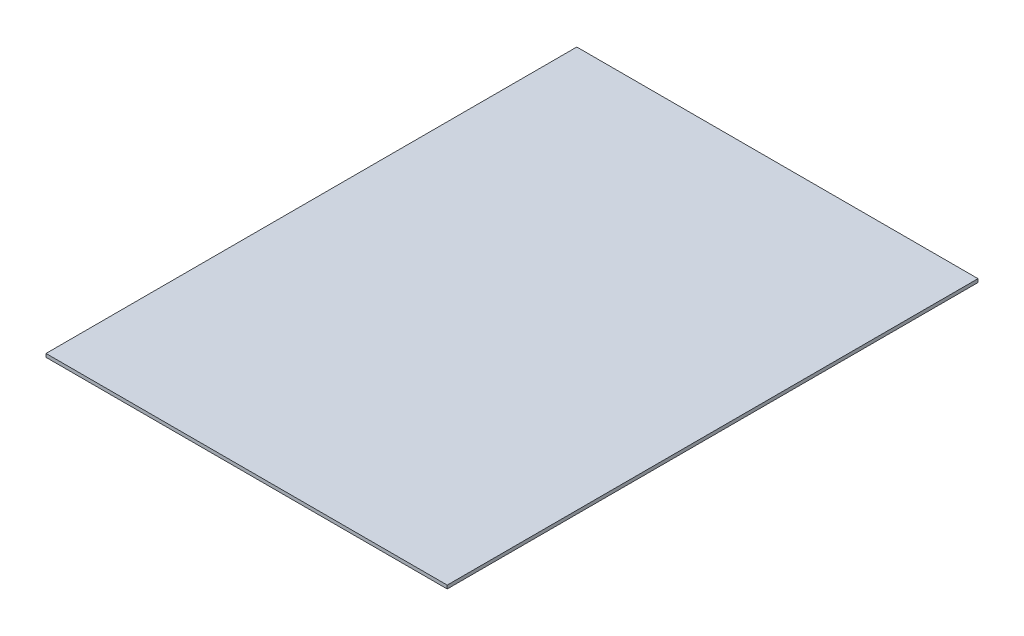
ISO-10303-21;
HEADER;
FILE_DESCRIPTION(('STEP AP214'),'2;1');
FILE_NAME('part.step','',(''),(''),'','','');
FILE_SCHEMA(('AUTOMOTIVE_DESIGN { 1 0 10303 214 1 1 1 1 }'));
ENDSEC;
DATA;
#1=APPLICATION_CONTEXT('core data for automotive mechanical design processes');
#2=APPLICATION_PROTOCOL_DEFINITION('international standard','automotive_design',2000,#1);
#3=PRODUCT_CONTEXT('',#1,'mechanical');
#4=PRODUCT('Part','Part','',(#3));
#5=PRODUCT_RELATED_PRODUCT_CATEGORY('part','',(#4));
#6=PRODUCT_DEFINITION_FORMATION('','',#4);
#7=PRODUCT_DEFINITION_CONTEXT('part definition',#1,'design');
#8=PRODUCT_DEFINITION('design','',#6,#7);
#9=PRODUCT_DEFINITION_SHAPE('','',#8);
#10=(LENGTH_UNIT() NAMED_UNIT(*) SI_UNIT(.MILLI.,.METRE.));
#11=(NAMED_UNIT(*) PLANE_ANGLE_UNIT() SI_UNIT($,.RADIAN.));
#12=(NAMED_UNIT(*) SI_UNIT($,.STERADIAN.) SOLID_ANGLE_UNIT());
#13=UNCERTAINTY_MEASURE_WITH_UNIT(LENGTH_MEASURE(1.E-05),#10,'distance_accuracy_value','');
#14=(GEOMETRIC_REPRESENTATION_CONTEXT(3) GLOBAL_UNCERTAINTY_ASSIGNED_CONTEXT((#13)) GLOBAL_UNIT_ASSIGNED_CONTEXT((#10,
#11,#12)) REPRESENTATION_CONTEXT('',''));
#15=CARTESIAN_POINT('',(0.,0.,0.));
#16=DIRECTION('',(0.,0.,1.));
#17=DIRECTION('',(1.,0.,0.));
#18=AXIS2_PLACEMENT_3D('',#15,#16,#17);
#19=CARTESIAN_POINT('',(187.198,1.5875,247.65));
#20=DIRECTION('',(-1.,0.,0.));
#21=DIRECTION('',(0.,0.,1.));
#22=AXIS2_PLACEMENT_3D('',#19,#20,#21);
#23=PLANE('',#22);
#24=DIRECTION('',(0.,0.,-1.));
#25=VECTOR('',#24,1.);
#26=CARTESIAN_POINT('',(187.198,-1.5875,247.65));
#27=LINE('',#26,#25);
#28=CARTESIAN_POINT('',(187.198,-1.5875,247.65));
#29=VERTEX_POINT('',#28);
#30=CARTESIAN_POINT('',(187.198,-1.5875,-247.65));
#31=VERTEX_POINT('',#30);
#32=EDGE_CURVE('E107',#29,#31,#27,.T.);
#33=ORIENTED_EDGE('',*,*,#32,.T.);
#34=DIRECTION('',(0.,-1.,0.));
#35=VECTOR('',#34,1.);
#36=CARTESIAN_POINT('',(187.198,1.5875,-247.65));
#37=LINE('',#36,#35);
#38=CARTESIAN_POINT('',(187.198,1.5875,-247.65));
#39=VERTEX_POINT('',#38);
#40=EDGE_CURVE('E11',#39,#31,#37,.T.);
#41=ORIENTED_EDGE('',*,*,#40,.F.);
#42=DIRECTION('',(0.,0.,-1.));
#43=VECTOR('',#42,1.);
#44=CARTESIAN_POINT('',(187.198,1.5875,247.65));
#45=LINE('',#44,#43);
#46=CARTESIAN_POINT('',(187.198,1.5875,247.65));
#47=VERTEX_POINT('',#46);
#48=EDGE_CURVE('E91',#47,#39,#45,.T.);
#49=ORIENTED_EDGE('',*,*,#48,.F.);
#50=DIRECTION('',(0.,-1.,0.));
#51=VECTOR('',#50,1.);
#52=CARTESIAN_POINT('',(187.198,1.5875,247.65));
#53=LINE('',#52,#51);
#54=EDGE_CURVE('E103',#47,#29,#53,.T.);
#55=ORIENTED_EDGE('',*,*,#54,.T.);
#56=EDGE_LOOP('',(#33,#41,#49,#55));
#57=FACE_BOUND('',#56,.T.);
#58=ADVANCED_FACE('F39',(#57),#23,.F.);
#59=CARTESIAN_POINT('',(-187.198,1.5875,-247.65));
#60=DIRECTION('',(0.,0.,1.));
#61=DIRECTION('',(1.,0.,0.));
#62=AXIS2_PLACEMENT_3D('',#59,#60,#61);
#63=PLANE('',#62);
#64=DIRECTION('',(-1.,0.,0.));
#65=VECTOR('',#64,1.);
#66=CARTESIAN_POINT('',(-187.198,-1.5875,-247.65));
#67=LINE('',#66,#65);
#68=CARTESIAN_POINT('',(-187.198,-1.5875,-247.65));
#69=VERTEX_POINT('',#68);
#70=EDGE_CURVE('E96',#31,#69,#67,.T.);
#71=ORIENTED_EDGE('',*,*,#70,.T.);
#72=DIRECTION('',(0.,-1.,0.));
#73=VECTOR('',#72,1.);
#74=CARTESIAN_POINT('',(-187.198,1.5875,-247.65));
#75=LINE('',#74,#73);
#76=CARTESIAN_POINT('',(-187.198,1.5875,-247.65));
#77=VERTEX_POINT('',#76);
#78=EDGE_CURVE('E48',#77,#69,#75,.T.);
#79=ORIENTED_EDGE('',*,*,#78,.F.);
#80=DIRECTION('',(-1.,0.,0.));
#81=VECTOR('',#80,1.);
#82=CARTESIAN_POINT('',(-187.198,1.5875,-247.65));
#83=LINE('',#82,#81);
#84=EDGE_CURVE('E86',#39,#77,#83,.T.);
#85=ORIENTED_EDGE('',*,*,#84,.F.);
#86=ORIENTED_EDGE('',*,*,#40,.T.);
#87=EDGE_LOOP('',(#71,#79,#85,#86));
#88=FACE_BOUND('',#87,.T.);
#89=ADVANCED_FACE('F95',(#88),#63,.F.);
#90=CARTESIAN_POINT('',(-187.198,1.5875,247.65));
#91=DIRECTION('',(1.,0.,0.));
#92=DIRECTION('',(0.,0.,-1.));
#93=AXIS2_PLACEMENT_3D('',#90,#91,#92);
#94=PLANE('',#93);
#95=DIRECTION('',(0.,0.,1.));
#96=VECTOR('',#95,1.);
#97=CARTESIAN_POINT('',(-187.198,-1.5875,247.65));
#98=LINE('',#97,#96);
#99=CARTESIAN_POINT('',(-187.198,-1.5875,247.65));
#100=VERTEX_POINT('',#99);
#101=EDGE_CURVE('E73',#69,#100,#98,.T.);
#102=ORIENTED_EDGE('',*,*,#101,.T.);
#103=DIRECTION('',(0.,-1.,0.));
#104=VECTOR('',#103,1.);
#105=CARTESIAN_POINT('',(-187.198,1.5875,247.65));
#106=LINE('',#105,#104);
#107=CARTESIAN_POINT('',(-187.198,1.5875,247.65));
#108=VERTEX_POINT('',#107);
#109=EDGE_CURVE('E98',#108,#100,#106,.T.);
#110=ORIENTED_EDGE('',*,*,#109,.F.);
#111=DIRECTION('',(0.,0.,1.));
#112=VECTOR('',#111,1.);
#113=CARTESIAN_POINT('',(-187.198,1.5875,247.65));
#114=LINE('',#113,#112);
#115=EDGE_CURVE('E89',#77,#108,#114,.T.);
#116=ORIENTED_EDGE('',*,*,#115,.F.);
#117=ORIENTED_EDGE('',*,*,#78,.T.);
#118=EDGE_LOOP('',(#102,#110,#116,#117));
#119=FACE_BOUND('',#118,.T.);
#120=ADVANCED_FACE('F99',(#119),#94,.F.);
#121=CARTESIAN_POINT('',(-187.198,1.5875,247.65));
#122=DIRECTION('',(0.,0.,-1.));
#123=DIRECTION('',(-1.,0.,0.));
#124=AXIS2_PLACEMENT_3D('',#121,#122,#123);
#125=PLANE('',#124);
#126=DIRECTION('',(1.,0.,0.));
#127=VECTOR('',#126,1.);
#128=CARTESIAN_POINT('',(-187.198,-1.5875,247.65));
#129=LINE('',#128,#127);
#130=EDGE_CURVE('E79',#100,#29,#129,.T.);
#131=ORIENTED_EDGE('',*,*,#130,.T.);
#132=ORIENTED_EDGE('',*,*,#54,.F.);
#133=DIRECTION('',(1.,0.,0.));
#134=VECTOR('',#133,1.);
#135=CARTESIAN_POINT('',(-187.198,1.5875,247.65));
#136=LINE('',#135,#134);
#137=EDGE_CURVE('E56',#108,#47,#136,.T.);
#138=ORIENTED_EDGE('',*,*,#137,.F.);
#139=ORIENTED_EDGE('',*,*,#109,.T.);
#140=EDGE_LOOP('',(#131,#132,#138,#139));
#141=FACE_BOUND('',#140,.T.);
#142=ADVANCED_FACE('F120',(#141),#125,.F.);
#143=CARTESIAN_POINT('',(0.,1.5875,0.));
#144=DIRECTION('',(0.,-1.,0.));
#145=DIRECTION('',(0.,0.,-1.));
#146=AXIS2_PLACEMENT_3D('',#143,#144,#145);
#147=PLANE('',#146);
#148=ORIENTED_EDGE('',*,*,#48,.T.);
#149=ORIENTED_EDGE('',*,*,#84,.T.);
#150=ORIENTED_EDGE('',*,*,#115,.T.);
#151=ORIENTED_EDGE('',*,*,#137,.T.);
#152=EDGE_LOOP('',(#148,#149,#150,#151));
#153=FACE_BOUND('',#152,.T.);
#154=ADVANCED_FACE('F87',(#153),#147,.F.);
#155=CARTESIAN_POINT('',(0.,-1.5875,0.));
#156=DIRECTION('',(0.,-1.,0.));
#157=DIRECTION('',(0.,0.,-1.));
#158=AXIS2_PLACEMENT_3D('',#155,#156,#157);
#159=PLANE('',#158);
#160=ORIENTED_EDGE('',*,*,#32,.F.);
#161=ORIENTED_EDGE('',*,*,#130,.F.);
#162=ORIENTED_EDGE('',*,*,#101,.F.);
#163=ORIENTED_EDGE('',*,*,#70,.F.);
#164=EDGE_LOOP('',(#160,#161,#162,#163));
#165=FACE_BOUND('',#164,.T.);
#166=ADVANCED_FACE('F123',(#165),#159,.T.);
#167=CLOSED_SHELL('',(#58,#89,#120,#142,#154,#166));
#168=MANIFOLD_SOLID_BREP('B2',#167);
#169=ADVANCED_BREP_SHAPE_REPRESENTATION('',(#18,#168),#14);
#170=SHAPE_DEFINITION_REPRESENTATION(#9,#169);
ENDSEC;
END-ISO-10303-21;
